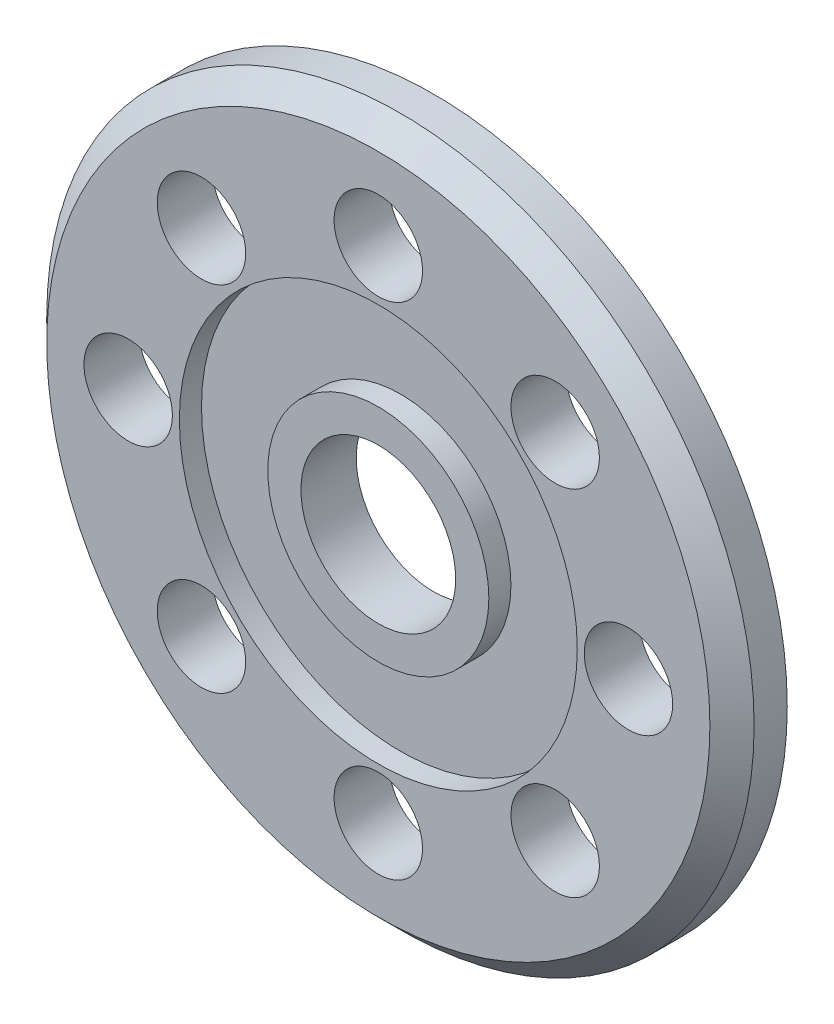
ISO-10303-21;
HEADER;
FILE_DESCRIPTION(('STEP AP214'),'2;1');
FILE_NAME('part.step','',(''),(''),'','','');
FILE_SCHEMA(('AUTOMOTIVE_DESIGN { 1 0 10303 214 1 1 1 1 }'));
ENDSEC;
DATA;
#1=APPLICATION_CONTEXT('core data for automotive mechanical design processes');
#2=APPLICATION_PROTOCOL_DEFINITION('international standard','automotive_design',2000,#1);
#3=PRODUCT_CONTEXT('',#1,'mechanical');
#4=PRODUCT('Part','Part','',(#3));
#5=PRODUCT_RELATED_PRODUCT_CATEGORY('part','',(#4));
#6=PRODUCT_DEFINITION_FORMATION('','',#4);
#7=PRODUCT_DEFINITION_CONTEXT('part definition',#1,'design');
#8=PRODUCT_DEFINITION('design','',#6,#7);
#9=PRODUCT_DEFINITION_SHAPE('','',#8);
#10=(LENGTH_UNIT() NAMED_UNIT(*) SI_UNIT(.MILLI.,.METRE.));
#11=(NAMED_UNIT(*) PLANE_ANGLE_UNIT() SI_UNIT($,.RADIAN.));
#12=(NAMED_UNIT(*) SI_UNIT($,.STERADIAN.) SOLID_ANGLE_UNIT());
#13=UNCERTAINTY_MEASURE_WITH_UNIT(LENGTH_MEASURE(1.E-05),#10,'distance_accuracy_value','');
#14=(GEOMETRIC_REPRESENTATION_CONTEXT(3) GLOBAL_UNCERTAINTY_ASSIGNED_CONTEXT((#13)) GLOBAL_UNIT_ASSIGNED_CONTEXT((#10,
#11,#12)) REPRESENTATION_CONTEXT('',''));
#15=CARTESIAN_POINT('',(0.,0.,0.));
#16=DIRECTION('',(0.,0.,1.));
#17=DIRECTION('',(1.,0.,0.));
#18=AXIS2_PLACEMENT_3D('',#15,#16,#17);
#19=CARTESIAN_POINT('',(0.,0.,2.5));
#20=DIRECTION('',(0.,0.,1.));
#21=DIRECTION('',(1.,0.,0.));
#22=AXIS2_PLACEMENT_3D('',#19,#20,#21);
#23=PLANE('',#22);
#24=CARTESIAN_POINT('',(0.,0.,2.5));
#25=DIRECTION('',(0.,0.,1.));
#26=DIRECTION('',(1.,0.,0.));
#27=AXIS2_PLACEMENT_3D('',#24,#25,#26);
#28=CIRCLE('',#27,3.5);
#29=CARTESIAN_POINT('',(3.5,0.,2.5));
#30=VERTEX_POINT('',#29);
#31=EDGE_CURVE('E71',#30,#30,#28,.T.);
#32=ORIENTED_EDGE('',*,*,#31,.F.);
#33=EDGE_LOOP('',(#32));
#34=FACE_BOUND('',#33,.T.);
#35=CARTESIAN_POINT('',(0.,0.,2.5));
#36=DIRECTION('',(0.,0.,1.));
#37=DIRECTION('',(1.,0.,0.));
#38=AXIS2_PLACEMENT_3D('',#35,#36,#37);
#39=CIRCLE('',#38,5.);
#40=CARTESIAN_POINT('',(5.,0.,2.5));
#41=VERTEX_POINT('',#40);
#42=EDGE_CURVE('E147',#41,#41,#39,.T.);
#43=ORIENTED_EDGE('',*,*,#42,.T.);
#44=EDGE_LOOP('',(#43));
#45=FACE_BOUND('',#44,.T.);
#46=ADVANCED_FACE('F45',(#34,#45),#23,.T.);
#47=CARTESIAN_POINT('',(0.,0.,2.5));
#48=DIRECTION('',(0.,0.,1.));
#49=DIRECTION('',(1.,0.,0.));
#50=AXIS2_PLACEMENT_3D('',#47,#48,#49);
#51=CIRCLE('',#50,15.);
#52=CARTESIAN_POINT('',(15.,0.,2.5));
#53=VERTEX_POINT('',#52);
#54=EDGE_CURVE('E54',#53,#53,#51,.T.);
#55=ORIENTED_EDGE('',*,*,#54,.T.);
#56=EDGE_LOOP('',(#55));
#57=FACE_BOUND('',#56,.T.);
#58=CARTESIAN_POINT('',(0.,0.,2.5));
#59=DIRECTION('',(0.,0.,1.));
#60=DIRECTION('',(1.,0.,0.));
#61=AXIS2_PLACEMENT_3D('',#58,#59,#60);
#62=CIRCLE('',#61,9.);
#63=CARTESIAN_POINT('',(9.,0.,2.5));
#64=VERTEX_POINT('',#63);
#65=EDGE_CURVE('E139',#64,#64,#62,.T.);
#66=ORIENTED_EDGE('',*,*,#65,.F.);
#67=EDGE_LOOP('',(#66));
#68=FACE_BOUND('',#67,.T.);
#69=CARTESIAN_POINT('',(-11.315,1.1851833404703E-13,2.5));
#70=DIRECTION('',(0.,0.,1.));
#71=DIRECTION('',(1.,0.,0.));
#72=AXIS2_PLACEMENT_3D('',#69,#70,#71);
#73=CIRCLE('',#72,2.);
#74=CARTESIAN_POINT('',(-9.315,1.1851833404703E-13,2.5));
#75=VERTEX_POINT('',#74);
#76=EDGE_CURVE('E119',#75,#75,#73,.T.);
#77=ORIENTED_EDGE('',*,*,#76,.F.);
#78=EDGE_LOOP('',(#77));
#79=FACE_BOUND('',#78,.T.);
#80=CARTESIAN_POINT('',(0.,-11.315,2.5));
#81=DIRECTION('',(0.,0.,1.));
#82=DIRECTION('',(1.,0.,0.));
#83=AXIS2_PLACEMENT_3D('',#80,#81,#82);
#84=CIRCLE('',#83,2.);
#85=CARTESIAN_POINT('',(1.99999999999992,-11.315,2.5));
#86=VERTEX_POINT('',#85);
#87=EDGE_CURVE('E103',#86,#86,#84,.T.);
#88=ORIENTED_EDGE('',*,*,#87,.F.);
#89=EDGE_LOOP('',(#88));
#90=FACE_BOUND('',#89,.T.);
#91=CARTESIAN_POINT('',(11.315,0.,2.5));
#92=DIRECTION('',(0.,0.,1.));
#93=DIRECTION('',(1.,0.,0.));
#94=AXIS2_PLACEMENT_3D('',#91,#92,#93);
#95=CIRCLE('',#94,2.);
#96=CARTESIAN_POINT('',(13.315,0.,2.5));
#97=VERTEX_POINT('',#96);
#98=EDGE_CURVE('E87',#97,#97,#95,.T.);
#99=ORIENTED_EDGE('',*,*,#98,.F.);
#100=EDGE_LOOP('',(#99));
#101=FACE_BOUND('',#100,.T.);
#102=CARTESIAN_POINT('',(0.,11.315,2.5));
#103=DIRECTION('',(0.,0.,1.));
#104=DIRECTION('',(1.,0.,0.));
#105=AXIS2_PLACEMENT_3D('',#102,#103,#104);
#106=CIRCLE('',#105,2.);
#107=CARTESIAN_POINT('',(2.,11.315,2.5));
#108=VERTEX_POINT('',#107);
#109=EDGE_CURVE('E64',#108,#108,#106,.T.);
#110=ORIENTED_EDGE('',*,*,#109,.F.);
#111=EDGE_LOOP('',(#110));
#112=FACE_BOUND('',#111,.T.);
#113=CARTESIAN_POINT('',(8.0009132291258,8.00091322912577,2.5));
#114=DIRECTION('',(0.,0.,1.));
#115=DIRECTION('',(1.,0.,0.));
#116=AXIS2_PLACEMENT_3D('',#113,#114,#115);
#117=CIRCLE('',#116,2.);
#118=CARTESIAN_POINT('',(10.0009132291258,8.00091322912577,2.5));
#119=VERTEX_POINT('',#118);
#120=EDGE_CURVE('E79',#119,#119,#117,.T.);
#121=ORIENTED_EDGE('',*,*,#120,.F.);
#122=EDGE_LOOP('',(#121));
#123=FACE_BOUND('',#122,.T.);
#124=CARTESIAN_POINT('',(8.00091322912574,-8.00091322912582,2.5));
#125=DIRECTION('',(0.,0.,1.));
#126=DIRECTION('',(1.,0.,0.));
#127=AXIS2_PLACEMENT_3D('',#124,#125,#126);
#128=CIRCLE('',#127,2.);
#129=CARTESIAN_POINT('',(10.0009132291257,-8.00091322912582,2.5));
#130=VERTEX_POINT('',#129);
#131=EDGE_CURVE('E95',#130,#130,#128,.T.);
#132=ORIENTED_EDGE('',*,*,#131,.F.);
#133=EDGE_LOOP('',(#132));
#134=FACE_BOUND('',#133,.T.);
#135=CARTESIAN_POINT('',(-8.00091322912585,-8.00091322912571,2.5));
#136=DIRECTION('',(0.,0.,1.));
#137=DIRECTION('',(1.,0.,0.));
#138=AXIS2_PLACEMENT_3D('',#135,#136,#137);
#139=CIRCLE('',#138,2.);
#140=CARTESIAN_POINT('',(-6.00091322912585,-8.00091322912571,2.5));
#141=VERTEX_POINT('',#140);
#142=EDGE_CURVE('E111',#141,#141,#139,.T.);
#143=ORIENTED_EDGE('',*,*,#142,.F.);
#144=EDGE_LOOP('',(#143));
#145=FACE_BOUND('',#144,.T.);
#146=CARTESIAN_POINT('',(-8.00091322912569,8.00091322912588,2.5));
#147=DIRECTION('',(0.,0.,1.));
#148=DIRECTION('',(1.,0.,0.));
#149=AXIS2_PLACEMENT_3D('',#146,#147,#148);
#150=CIRCLE('',#149,2.);
#151=CARTESIAN_POINT('',(-6.00091322912569,8.00091322912588,2.5));
#152=VERTEX_POINT('',#151);
#153=EDGE_CURVE('E127',#152,#152,#150,.T.);
#154=ORIENTED_EDGE('',*,*,#153,.F.);
#155=EDGE_LOOP('',(#154));
#156=FACE_BOUND('',#155,.T.);
#157=ADVANCED_FACE('F171',(#57,#68,#79,#90,#101,#112,#123,#134,#145,#156),#23,.T.);
#158=CARTESIAN_POINT('',(0.,0.,0.));
#159=DIRECTION('',(0.,0.,1.));
#160=DIRECTION('',(1.,0.,0.));
#161=AXIS2_PLACEMENT_3D('',#158,#159,#160);
#162=PLANE('',#161);
#163=CARTESIAN_POINT('',(0.,0.,0.));
#164=DIRECTION('',(0.,0.,1.));
#165=DIRECTION('',(1.,0.,0.));
#166=AXIS2_PLACEMENT_3D('',#163,#164,#165);
#167=CIRCLE('',#166,16.);
#168=CARTESIAN_POINT('',(16.,0.,0.));
#169=VERTEX_POINT('',#168);
#170=EDGE_CURVE('E59',#169,#169,#167,.T.);
#171=ORIENTED_EDGE('',*,*,#170,.F.);
#172=EDGE_LOOP('',(#171));
#173=FACE_BOUND('',#172,.T.);
#174=CARTESIAN_POINT('',(0.,11.315,0.));
#175=DIRECTION('',(0.,0.,1.));
#176=DIRECTION('',(1.,0.,0.));
#177=AXIS2_PLACEMENT_3D('',#174,#175,#176);
#178=CIRCLE('',#177,2.);
#179=CARTESIAN_POINT('',(2.,11.315,0.));
#180=VERTEX_POINT('',#179);
#181=EDGE_CURVE('E67',#180,#180,#178,.T.);
#182=ORIENTED_EDGE('',*,*,#181,.T.);
#183=EDGE_LOOP('',(#182));
#184=FACE_BOUND('',#183,.T.);
#185=CARTESIAN_POINT('',(0.,0.,0.));
#186=DIRECTION('',(0.,0.,1.));
#187=DIRECTION('',(1.,0.,0.));
#188=AXIS2_PLACEMENT_3D('',#185,#186,#187);
#189=CIRCLE('',#188,3.5);
#190=CARTESIAN_POINT('',(3.5,0.,0.));
#191=VERTEX_POINT('',#190);
#192=EDGE_CURVE('E75',#191,#191,#189,.T.);
#193=ORIENTED_EDGE('',*,*,#192,.T.);
#194=EDGE_LOOP('',(#193));
#195=FACE_BOUND('',#194,.T.);
#196=CARTESIAN_POINT('',(8.0009132291258,8.00091322912577,0.));
#197=DIRECTION('',(0.,0.,1.));
#198=DIRECTION('',(1.,0.,0.));
#199=AXIS2_PLACEMENT_3D('',#196,#197,#198);
#200=CIRCLE('',#199,2.);
#201=CARTESIAN_POINT('',(10.0009132291258,8.00091322912577,0.));
#202=VERTEX_POINT('',#201);
#203=EDGE_CURVE('E83',#202,#202,#200,.T.);
#204=ORIENTED_EDGE('',*,*,#203,.T.);
#205=EDGE_LOOP('',(#204));
#206=FACE_BOUND('',#205,.T.);
#207=CARTESIAN_POINT('',(11.315,0.,0.));
#208=DIRECTION('',(0.,0.,1.));
#209=DIRECTION('',(1.,0.,0.));
#210=AXIS2_PLACEMENT_3D('',#207,#208,#209);
#211=CIRCLE('',#210,2.);
#212=CARTESIAN_POINT('',(13.315,0.,0.));
#213=VERTEX_POINT('',#212);
#214=EDGE_CURVE('E91',#213,#213,#211,.T.);
#215=ORIENTED_EDGE('',*,*,#214,.T.);
#216=EDGE_LOOP('',(#215));
#217=FACE_BOUND('',#216,.T.);
#218=CARTESIAN_POINT('',(8.00091322912574,-8.00091322912582,0.));
#219=DIRECTION('',(0.,0.,1.));
#220=DIRECTION('',(1.,0.,0.));
#221=AXIS2_PLACEMENT_3D('',#218,#219,#220);
#222=CIRCLE('',#221,2.);
#223=CARTESIAN_POINT('',(10.0009132291257,-8.00091322912582,0.));
#224=VERTEX_POINT('',#223);
#225=EDGE_CURVE('E99',#224,#224,#222,.T.);
#226=ORIENTED_EDGE('',*,*,#225,.T.);
#227=EDGE_LOOP('',(#226));
#228=FACE_BOUND('',#227,.T.);
#229=CARTESIAN_POINT('',(0.,-11.315,0.));
#230=DIRECTION('',(0.,0.,1.));
#231=DIRECTION('',(1.,0.,0.));
#232=AXIS2_PLACEMENT_3D('',#229,#230,#231);
#233=CIRCLE('',#232,2.);
#234=CARTESIAN_POINT('',(1.99999999999992,-11.315,0.));
#235=VERTEX_POINT('',#234);
#236=EDGE_CURVE('E107',#235,#235,#233,.T.);
#237=ORIENTED_EDGE('',*,*,#236,.T.);
#238=EDGE_LOOP('',(#237));
#239=FACE_BOUND('',#238,.T.);
#240=CARTESIAN_POINT('',(-8.00091322912585,-8.00091322912571,0.));
#241=DIRECTION('',(0.,0.,1.));
#242=DIRECTION('',(1.,0.,0.));
#243=AXIS2_PLACEMENT_3D('',#240,#241,#242);
#244=CIRCLE('',#243,2.);
#245=CARTESIAN_POINT('',(-6.00091322912585,-8.00091322912571,0.));
#246=VERTEX_POINT('',#245);
#247=EDGE_CURVE('E115',#246,#246,#244,.T.);
#248=ORIENTED_EDGE('',*,*,#247,.T.);
#249=EDGE_LOOP('',(#248));
#250=FACE_BOUND('',#249,.T.);
#251=CARTESIAN_POINT('',(-11.315,1.1851833404703E-13,0.));
#252=DIRECTION('',(0.,0.,1.));
#253=DIRECTION('',(1.,0.,0.));
#254=AXIS2_PLACEMENT_3D('',#251,#252,#253);
#255=CIRCLE('',#254,2.);
#256=CARTESIAN_POINT('',(-9.315,1.1851833404703E-13,0.));
#257=VERTEX_POINT('',#256);
#258=EDGE_CURVE('E123',#257,#257,#255,.T.);
#259=ORIENTED_EDGE('',*,*,#258,.T.);
#260=EDGE_LOOP('',(#259));
#261=FACE_BOUND('',#260,.T.);
#262=CARTESIAN_POINT('',(-8.00091322912569,8.00091322912588,0.));
#263=DIRECTION('',(0.,0.,1.));
#264=DIRECTION('',(1.,0.,0.));
#265=AXIS2_PLACEMENT_3D('',#262,#263,#264);
#266=CIRCLE('',#265,2.);
#267=CARTESIAN_POINT('',(-6.00091322912569,8.00091322912588,0.));
#268=VERTEX_POINT('',#267);
#269=EDGE_CURVE('E131',#268,#268,#266,.T.);
#270=ORIENTED_EDGE('',*,*,#269,.T.);
#271=EDGE_LOOP('',(#270));
#272=FACE_BOUND('',#271,.T.);
#273=ADVANCED_FACE('F174',(#173,#184,#195,#206,#217,#228,#239,#250,#261,#272),#162,.F.);
#274=CARTESIAN_POINT('',(0.,0.,2.5));
#275=DIRECTION('',(0.,0.,-1.));
#276=DIRECTION('',(-1.,0.,0.));
#277=AXIS2_PLACEMENT_3D('',#274,#275,#276);
#278=CYLINDRICAL_SURFACE('',#277,16.);
#279=CARTESIAN_POINT('',(0.,0.,1.49999999999999));
#280=DIRECTION('',(0.,0.,1.));
#281=DIRECTION('',(1.,0.,0.));
#282=AXIS2_PLACEMENT_3D('',#279,#280,#281);
#283=CIRCLE('',#282,16.);
#284=CARTESIAN_POINT('',(16.,0.,1.49999999999999));
#285=VERTEX_POINT('',#284);
#286=EDGE_CURVE('E10',#285,#285,#283,.F.);
#287=ORIENTED_EDGE('',*,*,#286,.T.);
#288=EDGE_LOOP('',(#287));
#289=FACE_BOUND('',#288,.T.);
#290=ORIENTED_EDGE('',*,*,#170,.T.);
#291=EDGE_LOOP('',(#290));
#292=FACE_BOUND('',#291,.T.);
#293=ADVANCED_FACE('F199',(#289,#292),#278,.T.);
#294=CARTESIAN_POINT('',(0.,11.315,2.5));
#295=DIRECTION('',(0.,0.,-1.));
#296=DIRECTION('',(-1.,0.,0.));
#297=AXIS2_PLACEMENT_3D('',#294,#295,#296);
#298=CYLINDRICAL_SURFACE('',#297,2.);
#299=ORIENTED_EDGE('',*,*,#109,.T.);
#300=EDGE_LOOP('',(#299));
#301=FACE_BOUND('',#300,.T.);
#302=ORIENTED_EDGE('',*,*,#181,.F.);
#303=EDGE_LOOP('',(#302));
#304=FACE_BOUND('',#303,.T.);
#305=ADVANCED_FACE('F206',(#301,#304),#298,.F.);
#306=CARTESIAN_POINT('',(0.,0.,2.5));
#307=DIRECTION('',(0.,0.,-1.));
#308=DIRECTION('',(-1.,0.,0.));
#309=AXIS2_PLACEMENT_3D('',#306,#307,#308);
#310=CYLINDRICAL_SURFACE('',#309,3.5);
#311=ORIENTED_EDGE('',*,*,#31,.T.);
#312=EDGE_LOOP('',(#311));
#313=FACE_BOUND('',#312,.T.);
#314=ORIENTED_EDGE('',*,*,#192,.F.);
#315=EDGE_LOOP('',(#314));
#316=FACE_BOUND('',#315,.T.);
#317=ADVANCED_FACE('F217',(#313,#316),#310,.F.);
#318=CARTESIAN_POINT('',(8.0009132291258,8.00091322912577,2.5));
#319=DIRECTION('',(0.,0.,-1.));
#320=DIRECTION('',(-1.,0.,0.));
#321=AXIS2_PLACEMENT_3D('',#318,#319,#320);
#322=CYLINDRICAL_SURFACE('',#321,2.);
#323=ORIENTED_EDGE('',*,*,#120,.T.);
#324=EDGE_LOOP('',(#323));
#325=FACE_BOUND('',#324,.T.);
#326=ORIENTED_EDGE('',*,*,#203,.F.);
#327=EDGE_LOOP('',(#326));
#328=FACE_BOUND('',#327,.T.);
#329=ADVANCED_FACE('F221',(#325,#328),#322,.F.);
#330=CARTESIAN_POINT('',(11.315,0.,2.5));
#331=DIRECTION('',(0.,0.,-1.));
#332=DIRECTION('',(-1.,0.,0.));
#333=AXIS2_PLACEMENT_3D('',#330,#331,#332);
#334=CYLINDRICAL_SURFACE('',#333,2.);
#335=ORIENTED_EDGE('',*,*,#98,.T.);
#336=EDGE_LOOP('',(#335));
#337=FACE_BOUND('',#336,.T.);
#338=ORIENTED_EDGE('',*,*,#214,.F.);
#339=EDGE_LOOP('',(#338));
#340=FACE_BOUND('',#339,.T.);
#341=ADVANCED_FACE('F225',(#337,#340),#334,.F.);
#342=CARTESIAN_POINT('',(8.00091322912574,-8.00091322912582,2.5));
#343=DIRECTION('',(0.,0.,-1.));
#344=DIRECTION('',(-1.,0.,0.));
#345=AXIS2_PLACEMENT_3D('',#342,#343,#344);
#346=CYLINDRICAL_SURFACE('',#345,2.);
#347=ORIENTED_EDGE('',*,*,#131,.T.);
#348=EDGE_LOOP('',(#347));
#349=FACE_BOUND('',#348,.T.);
#350=ORIENTED_EDGE('',*,*,#225,.F.);
#351=EDGE_LOOP('',(#350));
#352=FACE_BOUND('',#351,.T.);
#353=ADVANCED_FACE('F229',(#349,#352),#346,.F.);
#354=CARTESIAN_POINT('',(0.,-11.315,2.5));
#355=DIRECTION('',(0.,0.,-1.));
#356=DIRECTION('',(-1.,0.,0.));
#357=AXIS2_PLACEMENT_3D('',#354,#355,#356);
#358=CYLINDRICAL_SURFACE('',#357,2.);
#359=ORIENTED_EDGE('',*,*,#87,.T.);
#360=EDGE_LOOP('',(#359));
#361=FACE_BOUND('',#360,.T.);
#362=ORIENTED_EDGE('',*,*,#236,.F.);
#363=EDGE_LOOP('',(#362));
#364=FACE_BOUND('',#363,.T.);
#365=ADVANCED_FACE('F233',(#361,#364),#358,.F.);
#366=CARTESIAN_POINT('',(-8.00091322912585,-8.00091322912571,2.5));
#367=DIRECTION('',(0.,0.,-1.));
#368=DIRECTION('',(-1.,0.,0.));
#369=AXIS2_PLACEMENT_3D('',#366,#367,#368);
#370=CYLINDRICAL_SURFACE('',#369,2.);
#371=ORIENTED_EDGE('',*,*,#142,.T.);
#372=EDGE_LOOP('',(#371));
#373=FACE_BOUND('',#372,.T.);
#374=ORIENTED_EDGE('',*,*,#247,.F.);
#375=EDGE_LOOP('',(#374));
#376=FACE_BOUND('',#375,.T.);
#377=ADVANCED_FACE('F237',(#373,#376),#370,.F.);
#378=CARTESIAN_POINT('',(-11.315,1.1851833404703E-13,2.5));
#379=DIRECTION('',(0.,0.,-1.));
#380=DIRECTION('',(-1.,0.,0.));
#381=AXIS2_PLACEMENT_3D('',#378,#379,#380);
#382=CYLINDRICAL_SURFACE('',#381,2.);
#383=ORIENTED_EDGE('',*,*,#76,.T.);
#384=EDGE_LOOP('',(#383));
#385=FACE_BOUND('',#384,.T.);
#386=ORIENTED_EDGE('',*,*,#258,.F.);
#387=EDGE_LOOP('',(#386));
#388=FACE_BOUND('',#387,.T.);
#389=ADVANCED_FACE('F194',(#385,#388),#382,.F.);
#390=CARTESIAN_POINT('',(-8.00091322912569,8.00091322912588,2.5));
#391=DIRECTION('',(0.,0.,-1.));
#392=DIRECTION('',(-1.,0.,0.));
#393=AXIS2_PLACEMENT_3D('',#390,#391,#392);
#394=CYLINDRICAL_SURFACE('',#393,2.);
#395=ORIENTED_EDGE('',*,*,#153,.T.);
#396=EDGE_LOOP('',(#395));
#397=FACE_BOUND('',#396,.T.);
#398=ORIENTED_EDGE('',*,*,#269,.F.);
#399=EDGE_LOOP('',(#398));
#400=FACE_BOUND('',#399,.T.);
#401=ADVANCED_FACE('F167',(#397,#400),#394,.F.);
#402=CARTESIAN_POINT('',(0.,0.,1.5));
#403=DIRECTION('',(0.,0.,1.));
#404=DIRECTION('',(1.,0.,0.));
#405=AXIS2_PLACEMENT_3D('',#402,#403,#404);
#406=CYLINDRICAL_SURFACE('',#405,9.);
#407=CARTESIAN_POINT('',(0.,0.,1.5));
#408=DIRECTION('',(0.,0.,1.));
#409=DIRECTION('',(1.,0.,0.));
#410=AXIS2_PLACEMENT_3D('',#407,#408,#409);
#411=CIRCLE('',#410,9.);
#412=CARTESIAN_POINT('',(9.,0.,1.5));
#413=VERTEX_POINT('',#412);
#414=EDGE_CURVE('E135',#413,#413,#411,.T.);
#415=ORIENTED_EDGE('',*,*,#414,.F.);
#416=EDGE_LOOP('',(#415));
#417=FACE_BOUND('',#416,.T.);
#418=ORIENTED_EDGE('',*,*,#65,.T.);
#419=EDGE_LOOP('',(#418));
#420=FACE_BOUND('',#419,.T.);
#421=ADVANCED_FACE('F161',(#417,#420),#406,.F.);
#422=CARTESIAN_POINT('',(0.,0.,1.5));
#423=DIRECTION('',(0.,0.,1.));
#424=DIRECTION('',(1.,0.,0.));
#425=AXIS2_PLACEMENT_3D('',#422,#423,#424);
#426=PLANE('',#425);
#427=CARTESIAN_POINT('',(0.,0.,1.5));
#428=DIRECTION('',(0.,0.,1.));
#429=DIRECTION('',(1.,0.,0.));
#430=AXIS2_PLACEMENT_3D('',#427,#428,#429);
#431=CIRCLE('',#430,5.);
#432=CARTESIAN_POINT('',(5.,0.,1.5));
#433=VERTEX_POINT('',#432);
#434=EDGE_CURVE('E143',#433,#433,#431,.T.);
#435=ORIENTED_EDGE('',*,*,#434,.F.);
#436=EDGE_LOOP('',(#435));
#437=FACE_BOUND('',#436,.T.);
#438=ORIENTED_EDGE('',*,*,#414,.T.);
#439=EDGE_LOOP('',(#438));
#440=FACE_BOUND('',#439,.T.);
#441=ADVANCED_FACE('F158',(#437,#440),#426,.T.);
#442=CARTESIAN_POINT('',(0.,0.,1.5));
#443=DIRECTION('',(0.,0.,1.));
#444=DIRECTION('',(1.,0.,0.));
#445=AXIS2_PLACEMENT_3D('',#442,#443,#444);
#446=CYLINDRICAL_SURFACE('',#445,5.);
#447=ORIENTED_EDGE('',*,*,#434,.T.);
#448=EDGE_LOOP('',(#447));
#449=FACE_BOUND('',#448,.T.);
#450=ORIENTED_EDGE('',*,*,#42,.F.);
#451=EDGE_LOOP('',(#450));
#452=FACE_BOUND('',#451,.T.);
#453=ADVANCED_FACE('F155',(#449,#452),#446,.T.);
#454=CARTESIAN_POINT('',(0.,0.,2.5));
#455=DIRECTION('',(0.,0.,-1.));
#456=DIRECTION('',(-1.,0.,0.));
#457=AXIS2_PLACEMENT_3D('',#454,#455,#456);
#458=CONICAL_SURFACE('',#457,15.,0.785398163397448);
#459=ORIENTED_EDGE('',*,*,#286,.F.);
#460=EDGE_LOOP('',(#459));
#461=FACE_BOUND('',#460,.T.);
#462=ORIENTED_EDGE('',*,*,#54,.F.);
#463=EDGE_LOOP('',(#462));
#464=FACE_BOUND('',#463,.T.);
#465=ADVANCED_FACE('F48',(#461,#464),#458,.T.);
#466=CLOSED_SHELL('',(#46,#157,#273,#293,#305,#317,#329,#341,#353,#365,#377,#389,#401,#421,#441,
#453,#465));
#467=MANIFOLD_SOLID_BREP('B2',#466);
#468=ADVANCED_BREP_SHAPE_REPRESENTATION('',(#18,#467),#14);
#469=SHAPE_DEFINITION_REPRESENTATION(#9,#468);
ENDSEC;
END-ISO-10303-21;
